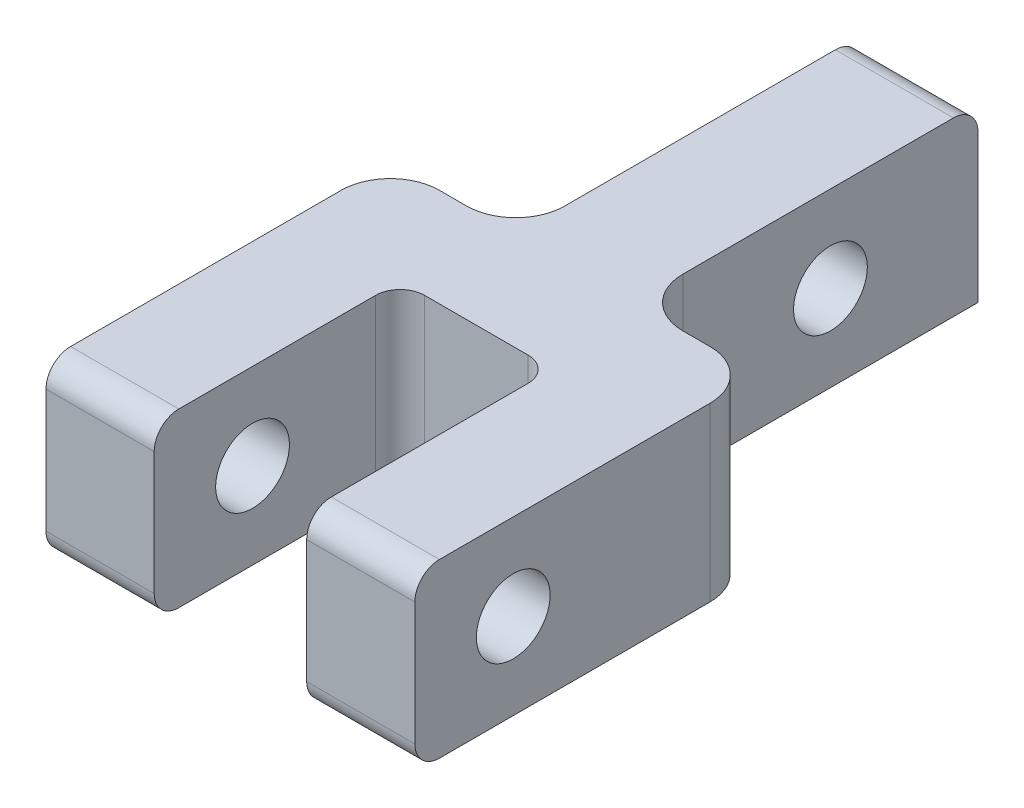
ISO-10303-21;
HEADER;
FILE_DESCRIPTION(('STEP AP214'),'2;1');
FILE_NAME('part.step','',(''),(''),'','','');
FILE_SCHEMA(('AUTOMOTIVE_DESIGN { 1 0 10303 214 1 1 1 1 }'));
ENDSEC;
DATA;
#1=APPLICATION_CONTEXT('core data for automotive mechanical design processes');
#2=APPLICATION_PROTOCOL_DEFINITION('international standard','automotive_design',2000,#1);
#3=PRODUCT_CONTEXT('',#1,'mechanical');
#4=PRODUCT('Part','Part','',(#3));
#5=PRODUCT_RELATED_PRODUCT_CATEGORY('part','',(#4));
#6=PRODUCT_DEFINITION_FORMATION('','',#4);
#7=PRODUCT_DEFINITION_CONTEXT('part definition',#1,'design');
#8=PRODUCT_DEFINITION('design','',#6,#7);
#9=PRODUCT_DEFINITION_SHAPE('','',#8);
#10=(LENGTH_UNIT() NAMED_UNIT(*) SI_UNIT(.MILLI.,.METRE.));
#11=(NAMED_UNIT(*) PLANE_ANGLE_UNIT() SI_UNIT($,.RADIAN.));
#12=(NAMED_UNIT(*) SI_UNIT($,.STERADIAN.) SOLID_ANGLE_UNIT());
#13=UNCERTAINTY_MEASURE_WITH_UNIT(LENGTH_MEASURE(1.E-05),#10,'distance_accuracy_value','');
#14=(GEOMETRIC_REPRESENTATION_CONTEXT(3) GLOBAL_UNCERTAINTY_ASSIGNED_CONTEXT((#13)) GLOBAL_UNIT_ASSIGNED_CONTEXT((#10,
#11,#12)) REPRESENTATION_CONTEXT('',''));
#15=CARTESIAN_POINT('',(0.,0.,0.));
#16=DIRECTION('',(0.,0.,1.));
#17=DIRECTION('',(1.,0.,0.));
#18=AXIS2_PLACEMENT_3D('',#15,#16,#17);
#19=CARTESIAN_POINT('',(2.4,-2.5,13.));
#20=DIRECTION('',(-1.,0.,0.));
#21=DIRECTION('',(0.,0.,1.));
#22=AXIS2_PLACEMENT_3D('',#19,#20,#21);
#23=CYLINDRICAL_SURFACE('',#22,1.);
#24=CARTESIAN_POINT('',(-3.1,-2.5,13.));
#25=DIRECTION('',(1.,0.,0.));
#26=DIRECTION('',(0.,0.,-1.));
#27=AXIS2_PLACEMENT_3D('',#24,#25,#26);
#28=CIRCLE('',#27,0.999999999999999);
#29=CARTESIAN_POINT('',(-3.1,-2.5,14.));
#30=VERTEX_POINT('',#29);
#31=CARTESIAN_POINT('',(-3.1,-3.5,13.));
#32=VERTEX_POINT('',#31);
#33=EDGE_CURVE('E208',#30,#32,#28,.T.);
#34=ORIENTED_EDGE('',*,*,#33,.F.);
#35=DIRECTION('',(-1.,0.,0.));
#36=VECTOR('',#35,1.);
#37=CARTESIAN_POINT('',(2.4,-2.5,14.));
#38=LINE('',#37,#36);
#39=CARTESIAN_POINT('',(-7.5,-2.5,14.));
#40=VERTEX_POINT('',#39);
#41=EDGE_CURVE('E207',#30,#40,#38,.T.);
#42=ORIENTED_EDGE('',*,*,#41,.T.);
#43=CARTESIAN_POINT('',(-7.5,-2.5,13.));
#44=DIRECTION('',(1.,0.,0.));
#45=DIRECTION('',(0.,0.,-1.));
#46=AXIS2_PLACEMENT_3D('',#43,#44,#45);
#47=CIRCLE('',#46,1.);
#48=CARTESIAN_POINT('',(-7.5,-3.5,13.));
#49=VERTEX_POINT('',#48);
#50=EDGE_CURVE('E350',#40,#49,#47,.T.);
#51=ORIENTED_EDGE('',*,*,#50,.T.);
#52=DIRECTION('',(-1.,0.,0.));
#53=VECTOR('',#52,1.);
#54=CARTESIAN_POINT('',(2.4,-3.5,13.));
#55=LINE('',#54,#53);
#56=EDGE_CURVE('E235',#32,#49,#55,.T.);
#57=ORIENTED_EDGE('',*,*,#56,.F.);
#58=EDGE_LOOP('',(#34,#42,#51,#57));
#59=FACE_BOUND('',#58,.T.);
#60=ADVANCED_FACE('F33',(#59),#23,.T.);
#61=CARTESIAN_POINT('',(2.4,-3.49999999999999,-14.));
#62=DIRECTION('',(0.,1.,0.));
#63=DIRECTION('',(0.,0.,1.));
#64=AXIS2_PLACEMENT_3D('',#61,#62,#63);
#65=PLANE('',#64);
#66=DIRECTION('',(-1.,0.,0.));
#67=VECTOR('',#66,1.);
#68=CARTESIAN_POINT('',(7.5,-3.5,0.));
#69=LINE('',#68,#67);
#70=CARTESIAN_POINT('',(5.5,-3.5,0.));
#71=VERTEX_POINT('',#70);
#72=CARTESIAN_POINT('',(4.4,-3.5,0.));
#73=VERTEX_POINT('',#72);
#74=EDGE_CURVE('E363',#71,#73,#69,.T.);
#75=ORIENTED_EDGE('',*,*,#74,.F.);
#76=CARTESIAN_POINT('',(5.5,-3.50000000000008,2.));
#77=DIRECTION('',(0.,1.,0.));
#78=DIRECTION('',(0.,0.,1.));
#79=AXIS2_PLACEMENT_3D('',#76,#77,#78);
#80=CIRCLE('',#79,2.);
#81=CARTESIAN_POINT('',(7.5,-3.5,2.));
#82=VERTEX_POINT('',#81);
#83=EDGE_CURVE('E260',#71,#82,#80,.F.);
#84=ORIENTED_EDGE('',*,*,#83,.T.);
#85=DIRECTION('',(0.,0.,-1.));
#86=VECTOR('',#85,1.);
#87=CARTESIAN_POINT('',(7.5,-3.5,0.));
#88=LINE('',#87,#86);
#89=CARTESIAN_POINT('',(7.5,-3.5,13.));
#90=VERTEX_POINT('',#89);
#91=EDGE_CURVE('E341',#90,#82,#88,.T.);
#92=ORIENTED_EDGE('',*,*,#91,.F.);
#93=CARTESIAN_POINT('',(3.1,-3.5,13.));
#94=VERTEX_POINT('',#93);
#95=EDGE_CURVE('E236',#90,#94,#55,.T.);
#96=ORIENTED_EDGE('',*,*,#95,.T.);
#97=DIRECTION('',(0.,0.,-1.));
#98=VECTOR('',#97,1.);
#99=CARTESIAN_POINT('',(3.1,-3.5,4.));
#100=LINE('',#99,#98);
#101=CARTESIAN_POINT('',(3.1,-3.5,5.));
#102=VERTEX_POINT('',#101);
#103=EDGE_CURVE('E321',#94,#102,#100,.T.);
#104=ORIENTED_EDGE('',*,*,#103,.T.);
#105=CARTESIAN_POINT('',(2.1,-3.50000000000009,5.));
#106=DIRECTION('',(0.,1.,0.));
#107=DIRECTION('',(0.,0.,1.));
#108=AXIS2_PLACEMENT_3D('',#105,#106,#107);
#109=CIRCLE('',#108,1.);
#110=CARTESIAN_POINT('',(2.1,-3.5,4.));
#111=VERTEX_POINT('',#110);
#112=EDGE_CURVE('E294',#102,#111,#109,.T.);
#113=ORIENTED_EDGE('',*,*,#112,.T.);
#114=DIRECTION('',(1.,0.,0.));
#115=VECTOR('',#114,1.);
#116=CARTESIAN_POINT('',(-3.1,-3.5,4.));
#117=LINE('',#116,#115);
#118=CARTESIAN_POINT('',(-2.1,-3.5,4.));
#119=VERTEX_POINT('',#118);
#120=EDGE_CURVE('E304',#119,#111,#117,.T.);
#121=ORIENTED_EDGE('',*,*,#120,.F.);
#122=CARTESIAN_POINT('',(-2.1,-3.50000000000009,5.));
#123=DIRECTION('',(0.,1.,0.));
#124=DIRECTION('',(0.,0.,1.));
#125=AXIS2_PLACEMENT_3D('',#122,#123,#124);
#126=CIRCLE('',#125,1.);
#127=CARTESIAN_POINT('',(-3.1,-3.5,5.));
#128=VERTEX_POINT('',#127);
#129=EDGE_CURVE('E11',#119,#128,#126,.T.);
#130=ORIENTED_EDGE('',*,*,#129,.T.);
#131=DIRECTION('',(0.,0.,-1.));
#132=VECTOR('',#131,1.);
#133=CARTESIAN_POINT('',(-3.1,-3.5,4.));
#134=LINE('',#133,#132);
#135=EDGE_CURVE('E306',#32,#128,#134,.T.);
#136=ORIENTED_EDGE('',*,*,#135,.F.);
#137=ORIENTED_EDGE('',*,*,#56,.T.);
#138=DIRECTION('',(0.,0.,-1.));
#139=VECTOR('',#138,1.);
#140=CARTESIAN_POINT('',(-7.5,-3.5,0.));
#141=LINE('',#140,#139);
#142=CARTESIAN_POINT('',(-7.5,-3.5,2.));
#143=VERTEX_POINT('',#142);
#144=EDGE_CURVE('E353',#49,#143,#141,.T.);
#145=ORIENTED_EDGE('',*,*,#144,.T.);
#146=CARTESIAN_POINT('',(-5.5,-3.50000000000008,2.));
#147=DIRECTION('',(0.,1.,0.));
#148=DIRECTION('',(0.,0.,1.));
#149=AXIS2_PLACEMENT_3D('',#146,#147,#148);
#150=CIRCLE('',#149,2.);
#151=CARTESIAN_POINT('',(-5.5,-3.5,0.));
#152=VERTEX_POINT('',#151);
#153=EDGE_CURVE('E258',#143,#152,#150,.F.);
#154=ORIENTED_EDGE('',*,*,#153,.T.);
#155=CARTESIAN_POINT('',(-4.4,-3.5,0.));
#156=VERTEX_POINT('',#155);
#157=EDGE_CURVE('E360',#156,#152,#69,.T.);
#158=ORIENTED_EDGE('',*,*,#157,.F.);
#159=CARTESIAN_POINT('',(-4.4,-3.50000000000006,-2.));
#160=DIRECTION('',(0.,1.,0.));
#161=DIRECTION('',(0.,0.,1.));
#162=AXIS2_PLACEMENT_3D('',#159,#160,#161);
#163=CIRCLE('',#162,2.);
#164=CARTESIAN_POINT('',(-2.4,-3.50000000000006,-2.));
#165=VERTEX_POINT('',#164);
#166=EDGE_CURVE('E279',#156,#165,#163,.T.);
#167=ORIENTED_EDGE('',*,*,#166,.T.);
#168=DIRECTION('',(0.,0.,-1.));
#169=VECTOR('',#168,1.);
#170=CARTESIAN_POINT('',(-2.4,-3.49999999999999,-14.));
#171=LINE('',#170,#169);
#172=CARTESIAN_POINT('',(-2.4,-3.49999999999999,-14.));
#173=VERTEX_POINT('',#172);
#174=EDGE_CURVE('E370',#165,#173,#171,.T.);
#175=ORIENTED_EDGE('',*,*,#174,.T.);
#176=DIRECTION('',(-1.,0.,0.));
#177=VECTOR('',#176,1.);
#178=CARTESIAN_POINT('',(2.4,-3.49999999999999,-14.));
#179=LINE('',#178,#177);
#180=CARTESIAN_POINT('',(2.4,-3.49999999999999,-14.));
#181=VERTEX_POINT('',#180);
#182=EDGE_CURVE('E232',#181,#173,#179,.T.);
#183=ORIENTED_EDGE('',*,*,#182,.F.);
#184=DIRECTION('',(0.,0.,-1.));
#185=VECTOR('',#184,1.);
#186=CARTESIAN_POINT('',(2.4,-3.5,13.));
#187=LINE('',#186,#185);
#188=CARTESIAN_POINT('',(2.4,-3.5,-2.));
#189=VERTEX_POINT('',#188);
#190=EDGE_CURVE('E371',#189,#181,#187,.T.);
#191=ORIENTED_EDGE('',*,*,#190,.F.);
#192=CARTESIAN_POINT('',(4.4,-3.50000000000006,-2.));
#193=DIRECTION('',(0.,1.,0.));
#194=DIRECTION('',(0.,0.,1.));
#195=AXIS2_PLACEMENT_3D('',#192,#193,#194);
#196=CIRCLE('',#195,2.);
#197=EDGE_CURVE('E275',#189,#73,#196,.T.);
#198=ORIENTED_EDGE('',*,*,#197,.T.);
#199=EDGE_LOOP('',(#75,#84,#92,#96,#104,#113,#121,#130,#136,#137,#145,#154,#158,#167,#175,#183,
#191,#198));
#200=FACE_BOUND('',#199,.T.);
#201=ADVANCED_FACE('F402',(#200),#65,.F.);
#202=CARTESIAN_POINT('',(2.4,3.5,13.));
#203=DIRECTION('',(0.,-1.,0.));
#204=DIRECTION('',(0.,0.,-1.));
#205=AXIS2_PLACEMENT_3D('',#202,#203,#204);
#206=PLANE('',#205);
#207=DIRECTION('',(0.,0.,1.));
#208=VECTOR('',#207,1.);
#209=CARTESIAN_POINT('',(7.5,3.5,13.));
#210=LINE('',#209,#208);
#211=CARTESIAN_POINT('',(7.5,3.5,2.));
#212=VERTEX_POINT('',#211);
#213=CARTESIAN_POINT('',(7.5,3.5,13.));
#214=VERTEX_POINT('',#213);
#215=EDGE_CURVE('E344',#212,#214,#210,.T.);
#216=ORIENTED_EDGE('',*,*,#215,.F.);
#217=CARTESIAN_POINT('',(5.5,3.5,2.));
#218=DIRECTION('',(0.,-1.,0.));
#219=DIRECTION('',(0.,0.,-1.));
#220=AXIS2_PLACEMENT_3D('',#217,#218,#219);
#221=CIRCLE('',#220,2.);
#222=CARTESIAN_POINT('',(5.5,3.5,0.));
#223=VERTEX_POINT('',#222);
#224=EDGE_CURVE('E252',#212,#223,#221,.F.);
#225=ORIENTED_EDGE('',*,*,#224,.T.);
#226=DIRECTION('',(-1.,0.,0.));
#227=VECTOR('',#226,1.);
#228=CARTESIAN_POINT('',(7.5,3.5,0.));
#229=LINE('',#228,#227);
#230=CARTESIAN_POINT('',(4.4,3.5,0.));
#231=VERTEX_POINT('',#230);
#232=EDGE_CURVE('E359',#223,#231,#229,.T.);
#233=ORIENTED_EDGE('',*,*,#232,.T.);
#234=CARTESIAN_POINT('',(4.4,3.5,-2.));
#235=DIRECTION('',(0.,-1.,0.));
#236=DIRECTION('',(0.,0.,-1.));
#237=AXIS2_PLACEMENT_3D('',#234,#235,#236);
#238=CIRCLE('',#237,2.);
#239=CARTESIAN_POINT('',(2.4,3.5,-2.));
#240=VERTEX_POINT('',#239);
#241=EDGE_CURVE('E277',#231,#240,#238,.T.);
#242=ORIENTED_EDGE('',*,*,#241,.T.);
#243=DIRECTION('',(0.,0.,1.));
#244=VECTOR('',#243,1.);
#245=CARTESIAN_POINT('',(2.4,3.5,13.));
#246=LINE('',#245,#244);
#247=CARTESIAN_POINT('',(2.4,3.5,-13.));
#248=VERTEX_POINT('',#247);
#249=EDGE_CURVE('E378',#248,#240,#246,.T.);
#250=ORIENTED_EDGE('',*,*,#249,.F.);
#251=DIRECTION('',(-1.,0.,0.));
#252=VECTOR('',#251,1.);
#253=CARTESIAN_POINT('',(2.4,3.5,-13.));
#254=LINE('',#253,#252);
#255=CARTESIAN_POINT('',(-2.4,3.5,-13.));
#256=VERTEX_POINT('',#255);
#257=EDGE_CURVE('E226',#248,#256,#254,.T.);
#258=ORIENTED_EDGE('',*,*,#257,.T.);
#259=DIRECTION('',(0.,0.,1.));
#260=VECTOR('',#259,1.);
#261=CARTESIAN_POINT('',(-2.4,3.5,13.));
#262=LINE('',#261,#260);
#263=CARTESIAN_POINT('',(-2.4,3.5,-2.));
#264=VERTEX_POINT('',#263);
#265=EDGE_CURVE('E374',#256,#264,#262,.T.);
#266=ORIENTED_EDGE('',*,*,#265,.T.);
#267=CARTESIAN_POINT('',(-4.4,3.5,-2.));
#268=DIRECTION('',(0.,-1.,0.));
#269=DIRECTION('',(0.,0.,-1.));
#270=AXIS2_PLACEMENT_3D('',#267,#268,#269);
#271=CIRCLE('',#270,2.);
#272=CARTESIAN_POINT('',(-4.4,3.5,0.));
#273=VERTEX_POINT('',#272);
#274=EDGE_CURVE('E281',#264,#273,#271,.T.);
#275=ORIENTED_EDGE('',*,*,#274,.T.);
#276=CARTESIAN_POINT('',(-5.5,3.5,0.));
#277=VERTEX_POINT('',#276);
#278=EDGE_CURVE('E346',#273,#277,#229,.T.);
#279=ORIENTED_EDGE('',*,*,#278,.T.);
#280=CARTESIAN_POINT('',(-5.5,3.5,2.));
#281=DIRECTION('',(0.,-1.,0.));
#282=DIRECTION('',(0.,0.,-1.));
#283=AXIS2_PLACEMENT_3D('',#280,#281,#282);
#284=CIRCLE('',#283,2.);
#285=CARTESIAN_POINT('',(-7.5,3.5,2.));
#286=VERTEX_POINT('',#285);
#287=EDGE_CURVE('E250',#277,#286,#284,.F.);
#288=ORIENTED_EDGE('',*,*,#287,.T.);
#289=DIRECTION('',(0.,0.,1.));
#290=VECTOR('',#289,1.);
#291=CARTESIAN_POINT('',(-7.5,3.5,13.));
#292=LINE('',#291,#290);
#293=CARTESIAN_POINT('',(-7.5,3.5,13.));
#294=VERTEX_POINT('',#293);
#295=EDGE_CURVE('E335',#286,#294,#292,.T.);
#296=ORIENTED_EDGE('',*,*,#295,.T.);
#297=DIRECTION('',(-1.,0.,0.));
#298=VECTOR('',#297,1.);
#299=CARTESIAN_POINT('',(2.4,3.5,13.));
#300=LINE('',#299,#298);
#301=CARTESIAN_POINT('',(-3.1,3.5,13.));
#302=VERTEX_POINT('',#301);
#303=EDGE_CURVE('E218',#302,#294,#300,.T.);
#304=ORIENTED_EDGE('',*,*,#303,.F.);
#305=DIRECTION('',(0.,0.,1.));
#306=VECTOR('',#305,1.);
#307=CARTESIAN_POINT('',(-3.1,3.5,13.));
#308=LINE('',#307,#306);
#309=CARTESIAN_POINT('',(-3.1,3.5,5.));
#310=VERTEX_POINT('',#309);
#311=EDGE_CURVE('E194',#310,#302,#308,.T.);
#312=ORIENTED_EDGE('',*,*,#311,.F.);
#313=CARTESIAN_POINT('',(-2.1,3.5,5.));
#314=DIRECTION('',(0.,-1.,0.));
#315=DIRECTION('',(0.,0.,-1.));
#316=AXIS2_PLACEMENT_3D('',#313,#314,#315);
#317=CIRCLE('',#316,1.);
#318=CARTESIAN_POINT('',(-2.1,3.5,4.));
#319=VERTEX_POINT('',#318);
#320=EDGE_CURVE('E41',#310,#319,#317,.T.);
#321=ORIENTED_EDGE('',*,*,#320,.T.);
#322=DIRECTION('',(1.,0.,0.));
#323=VECTOR('',#322,1.);
#324=CARTESIAN_POINT('',(-3.1,3.5,4.));
#325=LINE('',#324,#323);
#326=CARTESIAN_POINT('',(2.1,3.5,4.));
#327=VERTEX_POINT('',#326);
#328=EDGE_CURVE('E244',#319,#327,#325,.T.);
#329=ORIENTED_EDGE('',*,*,#328,.T.);
#330=CARTESIAN_POINT('',(2.1,3.5,5.));
#331=DIRECTION('',(0.,-1.,0.));
#332=DIRECTION('',(0.,0.,-1.));
#333=AXIS2_PLACEMENT_3D('',#330,#331,#332);
#334=CIRCLE('',#333,1.);
#335=CARTESIAN_POINT('',(3.1,3.5,5.));
#336=VERTEX_POINT('',#335);
#337=EDGE_CURVE('E292',#327,#336,#334,.T.);
#338=ORIENTED_EDGE('',*,*,#337,.T.);
#339=DIRECTION('',(0.,0.,1.));
#340=VECTOR('',#339,1.);
#341=CARTESIAN_POINT('',(3.1,3.5,13.));
#342=LINE('',#341,#340);
#343=CARTESIAN_POINT('',(3.1,3.5,13.));
#344=VERTEX_POINT('',#343);
#345=EDGE_CURVE('E199',#336,#344,#342,.T.);
#346=ORIENTED_EDGE('',*,*,#345,.T.);
#347=EDGE_CURVE('E223',#214,#344,#300,.T.);
#348=ORIENTED_EDGE('',*,*,#347,.F.);
#349=EDGE_LOOP('',(#216,#225,#233,#242,#250,#258,#266,#275,#279,#288,#296,#304,#312,#321,#329,
#338,#346,#348));
#350=FACE_BOUND('',#349,.T.);
#351=ADVANCED_FACE('F299',(#350),#206,.F.);
#352=CARTESIAN_POINT('',(2.4,2.5,13.));
#353=DIRECTION('',(-1.,0.,0.));
#354=DIRECTION('',(0.,0.,1.));
#355=AXIS2_PLACEMENT_3D('',#352,#353,#354);
#356=CYLINDRICAL_SURFACE('',#355,1.);
#357=CARTESIAN_POINT('',(-3.1,2.5,13.));
#358=DIRECTION('',(1.,0.,0.));
#359=DIRECTION('',(0.,0.,-1.));
#360=AXIS2_PLACEMENT_3D('',#357,#358,#359);
#361=CIRCLE('',#360,0.999999999999999);
#362=CARTESIAN_POINT('',(-3.1,2.5,14.));
#363=VERTEX_POINT('',#362);
#364=EDGE_CURVE('E187',#302,#363,#361,.T.);
#365=ORIENTED_EDGE('',*,*,#364,.F.);
#366=ORIENTED_EDGE('',*,*,#303,.T.);
#367=CARTESIAN_POINT('',(-7.5,2.5,13.));
#368=DIRECTION('',(1.,0.,0.));
#369=DIRECTION('',(0.,0.,-1.));
#370=AXIS2_PLACEMENT_3D('',#367,#368,#369);
#371=CIRCLE('',#370,0.999999999999999);
#372=CARTESIAN_POINT('',(-7.5,2.5,14.));
#373=VERTEX_POINT('',#372);
#374=EDGE_CURVE('E213',#294,#373,#371,.T.);
#375=ORIENTED_EDGE('',*,*,#374,.T.);
#376=DIRECTION('',(-1.,0.,0.));
#377=VECTOR('',#376,1.);
#378=CARTESIAN_POINT('',(2.4,2.5,14.));
#379=LINE('',#378,#377);
#380=EDGE_CURVE('E205',#363,#373,#379,.T.);
#381=ORIENTED_EDGE('',*,*,#380,.F.);
#382=EDGE_LOOP('',(#365,#366,#375,#381));
#383=FACE_BOUND('',#382,.T.);
#384=ADVANCED_FACE('F211',(#383),#356,.T.);
#385=CARTESIAN_POINT('',(2.4,2.5,14.));
#386=DIRECTION('',(0.,0.,-1.));
#387=DIRECTION('',(-1.,0.,0.));
#388=AXIS2_PLACEMENT_3D('',#385,#386,#387);
#389=PLANE('',#388);
#390=DIRECTION('',(0.,-1.,0.));
#391=VECTOR('',#390,1.);
#392=CARTESIAN_POINT('',(-3.1,2.5,14.));
#393=LINE('',#392,#391);
#394=EDGE_CURVE('E191',#363,#30,#393,.T.);
#395=ORIENTED_EDGE('',*,*,#394,.F.);
#396=ORIENTED_EDGE('',*,*,#380,.T.);
#397=DIRECTION('',(0.,-1.,0.));
#398=VECTOR('',#397,1.);
#399=CARTESIAN_POINT('',(-7.5,2.5,14.));
#400=LINE('',#399,#398);
#401=EDGE_CURVE('E348',#373,#40,#400,.T.);
#402=ORIENTED_EDGE('',*,*,#401,.T.);
#403=ORIENTED_EDGE('',*,*,#41,.F.);
#404=EDGE_LOOP('',(#395,#396,#402,#403));
#405=FACE_BOUND('',#404,.T.);
#406=ADVANCED_FACE('F203',(#405),#389,.F.);
#407=CARTESIAN_POINT('',(-2.4,0.,10.));
#408=DIRECTION('',(1.,0.,0.));
#409=DIRECTION('',(0.,0.,-1.));
#410=AXIS2_PLACEMENT_3D('',#407,#408,#409);
#411=CYLINDRICAL_SURFACE('',#410,1.5);
#412=CARTESIAN_POINT('',(-7.5,0.,10.));
#413=DIRECTION('',(1.,0.,0.));
#414=DIRECTION('',(0.,0.,-1.));
#415=AXIS2_PLACEMENT_3D('',#412,#413,#414);
#416=CIRCLE('',#415,1.5);
#417=CARTESIAN_POINT('',(-7.5,0.,8.49999999999999));
#418=VERTEX_POINT('',#417);
#419=EDGE_CURVE('E247',#418,#418,#416,.T.);
#420=ORIENTED_EDGE('',*,*,#419,.F.);
#421=EDGE_LOOP('',(#420));
#422=FACE_BOUND('',#421,.T.);
#423=CARTESIAN_POINT('',(-3.1,0.,10.));
#424=DIRECTION('',(1.,0.,0.));
#425=DIRECTION('',(0.,0.,-1.));
#426=AXIS2_PLACEMENT_3D('',#423,#424,#425);
#427=CIRCLE('',#426,1.5);
#428=CARTESIAN_POINT('',(-3.1,0.,8.49999999999999));
#429=VERTEX_POINT('',#428);
#430=EDGE_CURVE('E243',#429,#429,#427,.F.);
#431=ORIENTED_EDGE('',*,*,#430,.F.);
#432=EDGE_LOOP('',(#431));
#433=FACE_BOUND('',#432,.T.);
#434=ADVANCED_FACE('F495',(#422,#433),#411,.F.);
#435=CARTESIAN_POINT('',(2.4,-2.5,13.));
#436=DIRECTION('',(1.,0.,0.));
#437=DIRECTION('',(0.,0.,-1.));
#438=AXIS2_PLACEMENT_3D('',#435,#436,#437);
#439=PLANE('',#438);
#440=CARTESIAN_POINT('',(2.4,0.,-8.));
#441=DIRECTION('',(1.,0.,0.));
#442=DIRECTION('',(0.,0.,-1.));
#443=AXIS2_PLACEMENT_3D('',#440,#441,#442);
#444=CIRCLE('',#443,1.5);
#445=CARTESIAN_POINT('',(2.4,0.,-9.50000000000001));
#446=VERTEX_POINT('',#445);
#447=EDGE_CURVE('E364',#446,#446,#444,.T.);
#448=ORIENTED_EDGE('',*,*,#447,.F.);
#449=EDGE_LOOP('',(#448));
#450=FACE_BOUND('',#449,.T.);
#451=ORIENTED_EDGE('',*,*,#249,.T.);
#452=DIRECTION('',(0.,-1.,0.));
#453=VECTOR('',#452,1.);
#454=CARTESIAN_POINT('',(2.4,-2.5,-2.));
#455=LINE('',#454,#453);
#456=EDGE_CURVE('E270',#240,#189,#455,.T.);
#457=ORIENTED_EDGE('',*,*,#456,.T.);
#458=ORIENTED_EDGE('',*,*,#190,.T.);
#459=DIRECTION('',(0.,1.,0.));
#460=VECTOR('',#459,1.);
#461=CARTESIAN_POINT('',(2.4,-2.5,-14.));
#462=LINE('',#461,#460);
#463=CARTESIAN_POINT('',(2.4,2.5,-14.));
#464=VERTEX_POINT('',#463);
#465=EDGE_CURVE('E373',#181,#464,#462,.T.);
#466=ORIENTED_EDGE('',*,*,#465,.T.);
#467=CARTESIAN_POINT('',(2.4,2.5,-13.));
#468=DIRECTION('',(1.,0.,0.));
#469=DIRECTION('',(0.,0.,1.));
#470=AXIS2_PLACEMENT_3D('',#467,#468,#469);
#471=CIRCLE('',#470,1.);
#472=EDGE_CURVE('E376',#464,#248,#471,.T.);
#473=ORIENTED_EDGE('',*,*,#472,.T.);
#474=EDGE_LOOP('',(#451,#457,#458,#466,#473));
#475=FACE_BOUND('',#474,.T.);
#476=ADVANCED_FACE('F434',(#450,#475),#439,.T.);
#477=CARTESIAN_POINT('',(-2.4,-2.5,13.));
#478=DIRECTION('',(1.,0.,0.));
#479=DIRECTION('',(0.,0.,-1.));
#480=AXIS2_PLACEMENT_3D('',#477,#478,#479);
#481=PLANE('',#480);
#482=CARTESIAN_POINT('',(-2.4,0.,-8.));
#483=DIRECTION('',(1.,0.,0.));
#484=DIRECTION('',(0.,0.,-1.));
#485=AXIS2_PLACEMENT_3D('',#482,#483,#484);
#486=CIRCLE('',#485,1.5);
#487=CARTESIAN_POINT('',(-2.4,0.,-9.50000000000001));
#488=VERTEX_POINT('',#487);
#489=EDGE_CURVE('E367',#488,#488,#486,.T.);
#490=ORIENTED_EDGE('',*,*,#489,.T.);
#491=EDGE_LOOP('',(#490));
#492=FACE_BOUND('',#491,.T.);
#493=ORIENTED_EDGE('',*,*,#174,.F.);
#494=DIRECTION('',(0.,-1.,0.));
#495=VECTOR('',#494,1.);
#496=CARTESIAN_POINT('',(-2.4,3.5,-2.));
#497=LINE('',#496,#495);
#498=EDGE_CURVE('E273',#165,#264,#497,.F.);
#499=ORIENTED_EDGE('',*,*,#498,.T.);
#500=ORIENTED_EDGE('',*,*,#265,.F.);
#501=CARTESIAN_POINT('',(-2.4,2.5,-13.));
#502=DIRECTION('',(1.,0.,0.));
#503=DIRECTION('',(0.,0.,1.));
#504=AXIS2_PLACEMENT_3D('',#501,#502,#503);
#505=CIRCLE('',#504,1.);
#506=CARTESIAN_POINT('',(-2.4,2.5,-14.));
#507=VERTEX_POINT('',#506);
#508=EDGE_CURVE('E384',#507,#256,#505,.T.);
#509=ORIENTED_EDGE('',*,*,#508,.F.);
#510=DIRECTION('',(0.,1.,0.));
#511=VECTOR('',#510,1.);
#512=CARTESIAN_POINT('',(-2.4,2.5,-14.));
#513=LINE('',#512,#511);
#514=EDGE_CURVE('E382',#173,#507,#513,.T.);
#515=ORIENTED_EDGE('',*,*,#514,.F.);
#516=EDGE_LOOP('',(#493,#499,#500,#509,#515));
#517=FACE_BOUND('',#516,.T.);
#518=ADVANCED_FACE('F425',(#492,#517),#481,.F.);
#519=CARTESIAN_POINT('',(7.5,-2.5,14.));
#520=VERTEX_POINT('',#519);
#521=CARTESIAN_POINT('',(3.1,-2.5,14.));
#522=VERTEX_POINT('',#521);
#523=EDGE_CURVE('E215',#520,#522,#38,.T.);
#524=ORIENTED_EDGE('',*,*,#523,.T.);
#525=CARTESIAN_POINT('',(3.1,-2.5,13.));
#526=DIRECTION('',(1.,0.,0.));
#527=DIRECTION('',(0.,0.,-1.));
#528=AXIS2_PLACEMENT_3D('',#525,#526,#527);
#529=CIRCLE('',#528,0.999999999999999);
#530=EDGE_CURVE('E318',#522,#94,#529,.T.);
#531=ORIENTED_EDGE('',*,*,#530,.T.);
#532=ORIENTED_EDGE('',*,*,#95,.F.);
#533=CARTESIAN_POINT('',(7.5,-2.5,13.));
#534=DIRECTION('',(1.,0.,0.));
#535=DIRECTION('',(0.,0.,-1.));
#536=AXIS2_PLACEMENT_3D('',#533,#534,#535);
#537=CIRCLE('',#536,1.);
#538=EDGE_CURVE('E338',#520,#90,#537,.T.);
#539=ORIENTED_EDGE('',*,*,#538,.F.);
#540=EDGE_LOOP('',(#524,#531,#532,#539));
#541=FACE_BOUND('',#540,.T.);
#542=ADVANCED_FACE('F417',(#541),#23,.T.);
#543=CARTESIAN_POINT('',(2.4,2.5,-14.));
#544=DIRECTION('',(0.,0.,1.));
#545=DIRECTION('',(1.,0.,0.));
#546=AXIS2_PLACEMENT_3D('',#543,#544,#545);
#547=PLANE('',#546);
#548=ORIENTED_EDGE('',*,*,#514,.T.);
#549=DIRECTION('',(-1.,0.,0.));
#550=VECTOR('',#549,1.);
#551=CARTESIAN_POINT('',(2.4,2.5,-14.));
#552=LINE('',#551,#550);
#553=EDGE_CURVE('E229',#464,#507,#552,.T.);
#554=ORIENTED_EDGE('',*,*,#553,.F.);
#555=ORIENTED_EDGE('',*,*,#465,.F.);
#556=ORIENTED_EDGE('',*,*,#182,.T.);
#557=EDGE_LOOP('',(#548,#554,#555,#556));
#558=FACE_BOUND('',#557,.T.);
#559=ADVANCED_FACE('F424',(#558),#547,.F.);
#560=CARTESIAN_POINT('',(2.4,2.5,-13.));
#561=DIRECTION('',(-1.,0.,0.));
#562=DIRECTION('',(0.,0.,1.));
#563=AXIS2_PLACEMENT_3D('',#560,#561,#562);
#564=CYLINDRICAL_SURFACE('',#563,1.);
#565=ORIENTED_EDGE('',*,*,#508,.T.);
#566=ORIENTED_EDGE('',*,*,#257,.F.);
#567=ORIENTED_EDGE('',*,*,#472,.F.);
#568=ORIENTED_EDGE('',*,*,#553,.T.);
#569=EDGE_LOOP('',(#565,#566,#567,#568));
#570=FACE_BOUND('',#569,.T.);
#571=ADVANCED_FACE('F431',(#570),#564,.T.);
#572=ORIENTED_EDGE('',*,*,#347,.T.);
#573=CARTESIAN_POINT('',(3.1,2.5,13.));
#574=DIRECTION('',(1.,0.,0.));
#575=DIRECTION('',(0.,0.,-1.));
#576=AXIS2_PLACEMENT_3D('',#573,#574,#575);
#577=CIRCLE('',#576,0.999999999999999);
#578=CARTESIAN_POINT('',(3.1,2.5,14.));
#579=VERTEX_POINT('',#578);
#580=EDGE_CURVE('E312',#344,#579,#577,.T.);
#581=ORIENTED_EDGE('',*,*,#580,.T.);
#582=CARTESIAN_POINT('',(7.5,2.5,14.));
#583=VERTEX_POINT('',#582);
#584=EDGE_CURVE('E214',#583,#579,#379,.T.);
#585=ORIENTED_EDGE('',*,*,#584,.F.);
#586=CARTESIAN_POINT('',(7.5,2.5,13.));
#587=DIRECTION('',(1.,0.,0.));
#588=DIRECTION('',(0.,0.,-1.));
#589=AXIS2_PLACEMENT_3D('',#586,#587,#588);
#590=CIRCLE('',#589,0.999999999999999);
#591=EDGE_CURVE('E331',#214,#583,#590,.T.);
#592=ORIENTED_EDGE('',*,*,#591,.F.);
#593=EDGE_LOOP('',(#572,#581,#585,#592));
#594=FACE_BOUND('',#593,.T.);
#595=ADVANCED_FACE('F448',(#594),#356,.T.);
#596=ORIENTED_EDGE('',*,*,#584,.T.);
#597=DIRECTION('',(0.,-1.,0.));
#598=VECTOR('',#597,1.);
#599=CARTESIAN_POINT('',(3.1,2.5,14.));
#600=LINE('',#599,#598);
#601=EDGE_CURVE('E315',#579,#522,#600,.T.);
#602=ORIENTED_EDGE('',*,*,#601,.T.);
#603=ORIENTED_EDGE('',*,*,#523,.F.);
#604=DIRECTION('',(0.,-1.,0.));
#605=VECTOR('',#604,1.);
#606=CARTESIAN_POINT('',(7.5,2.5,14.));
#607=LINE('',#606,#605);
#608=EDGE_CURVE('E334',#583,#520,#607,.T.);
#609=ORIENTED_EDGE('',*,*,#608,.F.);
#610=EDGE_LOOP('',(#596,#602,#603,#609));
#611=FACE_BOUND('',#610,.T.);
#612=ADVANCED_FACE('F440',(#611),#389,.F.);
#613=CARTESIAN_POINT('',(-2.4,0.,-8.));
#614=DIRECTION('',(1.,0.,0.));
#615=DIRECTION('',(0.,0.,-1.));
#616=AXIS2_PLACEMENT_3D('',#613,#614,#615);
#617=CYLINDRICAL_SURFACE('',#616,1.5);
#618=ORIENTED_EDGE('',*,*,#489,.F.);
#619=EDGE_LOOP('',(#618));
#620=FACE_BOUND('',#619,.T.);
#621=ORIENTED_EDGE('',*,*,#447,.T.);
#622=EDGE_LOOP('',(#621));
#623=FACE_BOUND('',#622,.T.);
#624=ADVANCED_FACE('F491',(#620,#623),#617,.F.);
#625=CARTESIAN_POINT('',(7.5,3.5,0.));
#626=DIRECTION('',(0.,0.,1.));
#627=DIRECTION('',(0.,-1.,0.));
#628=AXIS2_PLACEMENT_3D('',#625,#626,#627);
#629=PLANE('',#628);
#630=ORIENTED_EDGE('',*,*,#157,.T.);
#631=DIRECTION('',(0.,1.,0.));
#632=VECTOR('',#631,1.);
#633=CARTESIAN_POINT('',(-5.5,3.5,0.));
#634=LINE('',#633,#632);
#635=EDGE_CURVE('E265',#152,#277,#634,.T.);
#636=ORIENTED_EDGE('',*,*,#635,.T.);
#637=ORIENTED_EDGE('',*,*,#278,.F.);
#638=DIRECTION('',(0.,-1.,0.));
#639=VECTOR('',#638,1.);
#640=CARTESIAN_POINT('',(-4.4,-3.5,0.));
#641=LINE('',#640,#639);
#642=EDGE_CURVE('E262',#273,#156,#641,.T.);
#643=ORIENTED_EDGE('',*,*,#642,.T.);
#644=EDGE_LOOP('',(#630,#636,#637,#643));
#645=FACE_BOUND('',#644,.T.);
#646=ADVANCED_FACE('F399',(#645),#629,.F.);
#647=CARTESIAN_POINT('',(-7.5,2.5,13.));
#648=DIRECTION('',(1.,0.,0.));
#649=DIRECTION('',(0.,0.,-1.));
#650=AXIS2_PLACEMENT_3D('',#647,#648,#649);
#651=PLANE('',#650);
#652=ORIENTED_EDGE('',*,*,#295,.F.);
#653=DIRECTION('',(0.,1.,0.));
#654=VECTOR('',#653,1.);
#655=CARTESIAN_POINT('',(-7.5,2.5,2.));
#656=LINE('',#655,#654);
#657=EDGE_CURVE('E268',#286,#143,#656,.F.);
#658=ORIENTED_EDGE('',*,*,#657,.T.);
#659=ORIENTED_EDGE('',*,*,#144,.F.);
#660=ORIENTED_EDGE('',*,*,#50,.F.);
#661=ORIENTED_EDGE('',*,*,#401,.F.);
#662=ORIENTED_EDGE('',*,*,#374,.F.);
#663=EDGE_LOOP('',(#652,#658,#659,#660,#661,#662));
#664=FACE_BOUND('',#663,.T.);
#665=ORIENTED_EDGE('',*,*,#419,.T.);
#666=EDGE_LOOP('',(#665));
#667=FACE_BOUND('',#666,.T.);
#668=ADVANCED_FACE('F411',(#664,#667),#651,.F.);
#669=CARTESIAN_POINT('',(3.1,0.,10.));
#670=DIRECTION('',(1.,0.,0.));
#671=DIRECTION('',(0.,0.,-1.));
#672=AXIS2_PLACEMENT_3D('',#669,#670,#671);
#673=CIRCLE('',#672,1.5);
#674=CARTESIAN_POINT('',(3.1,0.,8.49999999999999));
#675=VERTEX_POINT('',#674);
#676=EDGE_CURVE('E240',#675,#675,#673,.F.);
#677=ORIENTED_EDGE('',*,*,#676,.T.);
#678=EDGE_LOOP('',(#677));
#679=FACE_BOUND('',#678,.T.);
#680=CARTESIAN_POINT('',(7.5,0.,10.));
#681=DIRECTION('',(1.,0.,0.));
#682=DIRECTION('',(0.,0.,-1.));
#683=AXIS2_PLACEMENT_3D('',#680,#681,#682);
#684=CIRCLE('',#683,1.5);
#685=CARTESIAN_POINT('',(7.5,0.,8.49999999999999));
#686=VERTEX_POINT('',#685);
#687=EDGE_CURVE('E326',#686,#686,#684,.T.);
#688=ORIENTED_EDGE('',*,*,#687,.T.);
#689=EDGE_LOOP('',(#688));
#690=FACE_BOUND('',#689,.T.);
#691=ADVANCED_FACE('F500',(#679,#690),#411,.F.);
#692=CARTESIAN_POINT('',(7.5,2.5,13.));
#693=DIRECTION('',(1.,0.,0.));
#694=DIRECTION('',(0.,0.,-1.));
#695=AXIS2_PLACEMENT_3D('',#692,#693,#694);
#696=PLANE('',#695);
#697=ORIENTED_EDGE('',*,*,#91,.T.);
#698=DIRECTION('',(0.,1.,0.));
#699=VECTOR('',#698,1.);
#700=CARTESIAN_POINT('',(7.5,3.5,2.));
#701=LINE('',#700,#699);
#702=EDGE_CURVE('E239',#82,#212,#701,.T.);
#703=ORIENTED_EDGE('',*,*,#702,.T.);
#704=ORIENTED_EDGE('',*,*,#215,.T.);
#705=ORIENTED_EDGE('',*,*,#591,.T.);
#706=ORIENTED_EDGE('',*,*,#608,.T.);
#707=ORIENTED_EDGE('',*,*,#538,.T.);
#708=EDGE_LOOP('',(#697,#703,#704,#705,#706,#707));
#709=FACE_BOUND('',#708,.T.);
#710=ORIENTED_EDGE('',*,*,#687,.F.);
#711=EDGE_LOOP('',(#710));
#712=FACE_BOUND('',#711,.T.);
#713=ADVANCED_FACE('F442',(#709,#712),#696,.T.);
#714=ORIENTED_EDGE('',*,*,#232,.F.);
#715=DIRECTION('',(0.,1.,0.));
#716=VECTOR('',#715,1.);
#717=CARTESIAN_POINT('',(5.5,-3.5,0.));
#718=LINE('',#717,#716);
#719=EDGE_CURVE('E256',#223,#71,#718,.F.);
#720=ORIENTED_EDGE('',*,*,#719,.T.);
#721=ORIENTED_EDGE('',*,*,#74,.T.);
#722=DIRECTION('',(0.,-1.,0.));
#723=VECTOR('',#722,1.);
#724=CARTESIAN_POINT('',(4.4,3.5,0.));
#725=LINE('',#724,#723);
#726=EDGE_CURVE('E254',#73,#231,#725,.F.);
#727=ORIENTED_EDGE('',*,*,#726,.T.);
#728=EDGE_LOOP('',(#714,#720,#721,#727));
#729=FACE_BOUND('',#728,.T.);
#730=ADVANCED_FACE('F465',(#729),#629,.F.);
#731=CARTESIAN_POINT('',(-3.1,2.5,13.));
#732=DIRECTION('',(1.,0.,0.));
#733=DIRECTION('',(0.,0.,-1.));
#734=AXIS2_PLACEMENT_3D('',#731,#732,#733);
#735=PLANE('',#734);
#736=ORIENTED_EDGE('',*,*,#135,.T.);
#737=DIRECTION('',(0.,1.,0.));
#738=VECTOR('',#737,1.);
#739=CARTESIAN_POINT('',(-3.1,2.5,5.));
#740=LINE('',#739,#738);
#741=EDGE_CURVE('E290',#128,#310,#740,.T.);
#742=ORIENTED_EDGE('',*,*,#741,.T.);
#743=ORIENTED_EDGE('',*,*,#311,.T.);
#744=ORIENTED_EDGE('',*,*,#364,.T.);
#745=ORIENTED_EDGE('',*,*,#394,.T.);
#746=ORIENTED_EDGE('',*,*,#33,.T.);
#747=EDGE_LOOP('',(#736,#742,#743,#744,#745,#746));
#748=FACE_BOUND('',#747,.T.);
#749=ORIENTED_EDGE('',*,*,#430,.T.);
#750=EDGE_LOOP('',(#749));
#751=FACE_BOUND('',#750,.T.);
#752=ADVANCED_FACE('F189',(#748,#751),#735,.T.);
#753=CARTESIAN_POINT('',(3.1,2.5,13.));
#754=DIRECTION('',(1.,0.,0.));
#755=DIRECTION('',(0.,0.,-1.));
#756=AXIS2_PLACEMENT_3D('',#753,#754,#755);
#757=PLANE('',#756);
#758=ORIENTED_EDGE('',*,*,#345,.F.);
#759=DIRECTION('',(0.,1.,0.));
#760=VECTOR('',#759,1.);
#761=CARTESIAN_POINT('',(3.1,-3.5,5.));
#762=LINE('',#761,#760);
#763=EDGE_CURVE('E288',#336,#102,#762,.F.);
#764=ORIENTED_EDGE('',*,*,#763,.T.);
#765=ORIENTED_EDGE('',*,*,#103,.F.);
#766=ORIENTED_EDGE('',*,*,#530,.F.);
#767=ORIENTED_EDGE('',*,*,#601,.F.);
#768=ORIENTED_EDGE('',*,*,#580,.F.);
#769=EDGE_LOOP('',(#758,#764,#765,#766,#767,#768));
#770=FACE_BOUND('',#769,.T.);
#771=ORIENTED_EDGE('',*,*,#676,.F.);
#772=EDGE_LOOP('',(#771));
#773=FACE_BOUND('',#772,.T.);
#774=ADVANCED_FACE('F452',(#770,#773),#757,.F.);
#775=CARTESIAN_POINT('',(-3.1,3.5,4.));
#776=DIRECTION('',(0.,0.,-1.));
#777=DIRECTION('',(-1.,0.,0.));
#778=AXIS2_PLACEMENT_3D('',#775,#776,#777);
#779=PLANE('',#778);
#780=ORIENTED_EDGE('',*,*,#120,.T.);
#781=DIRECTION('',(0.,1.,0.));
#782=VECTOR('',#781,1.);
#783=CARTESIAN_POINT('',(2.1,3.5,4.));
#784=LINE('',#783,#782);
#785=EDGE_CURVE('E285',#111,#327,#784,.T.);
#786=ORIENTED_EDGE('',*,*,#785,.T.);
#787=ORIENTED_EDGE('',*,*,#328,.F.);
#788=DIRECTION('',(0.,1.,0.));
#789=VECTOR('',#788,1.);
#790=CARTESIAN_POINT('',(-2.1,3.5,4.));
#791=LINE('',#790,#789);
#792=EDGE_CURVE('E283',#319,#119,#791,.F.);
#793=ORIENTED_EDGE('',*,*,#792,.T.);
#794=EDGE_LOOP('',(#780,#786,#787,#793));
#795=FACE_BOUND('',#794,.T.);
#796=ADVANCED_FACE('F302',(#795),#779,.F.);
#797=CARTESIAN_POINT('',(5.5,2.5,2.));
#798=DIRECTION('',(0.,-1.,0.));
#799=DIRECTION('',(0.,0.,-1.));
#800=AXIS2_PLACEMENT_3D('',#797,#798,#799);
#801=CYLINDRICAL_SURFACE('',#800,2.);
#802=ORIENTED_EDGE('',*,*,#83,.F.);
#803=ORIENTED_EDGE('',*,*,#719,.F.);
#804=ORIENTED_EDGE('',*,*,#224,.F.);
#805=ORIENTED_EDGE('',*,*,#702,.F.);
#806=EDGE_LOOP('',(#802,#803,#804,#805));
#807=FACE_BOUND('',#806,.T.);
#808=ADVANCED_FACE('F469',(#807),#801,.T.);
#809=CARTESIAN_POINT('',(-5.5,3.5,2.));
#810=DIRECTION('',(0.,1.,0.));
#811=DIRECTION('',(0.,0.,1.));
#812=AXIS2_PLACEMENT_3D('',#809,#810,#811);
#813=CYLINDRICAL_SURFACE('',#812,2.);
#814=ORIENTED_EDGE('',*,*,#153,.F.);
#815=ORIENTED_EDGE('',*,*,#657,.F.);
#816=ORIENTED_EDGE('',*,*,#287,.F.);
#817=ORIENTED_EDGE('',*,*,#635,.F.);
#818=EDGE_LOOP('',(#814,#815,#816,#817));
#819=FACE_BOUND('',#818,.T.);
#820=ADVANCED_FACE('F408',(#819),#813,.T.);
#821=CARTESIAN_POINT('',(4.4,-2.5,-2.));
#822=DIRECTION('',(0.,-1.,0.));
#823=DIRECTION('',(0.,0.,-1.));
#824=AXIS2_PLACEMENT_3D('',#821,#822,#823);
#825=CYLINDRICAL_SURFACE('',#824,2.);
#826=ORIENTED_EDGE('',*,*,#241,.F.);
#827=ORIENTED_EDGE('',*,*,#726,.F.);
#828=ORIENTED_EDGE('',*,*,#197,.F.);
#829=ORIENTED_EDGE('',*,*,#456,.F.);
#830=EDGE_LOOP('',(#826,#827,#828,#829));
#831=FACE_BOUND('',#830,.T.);
#832=ADVANCED_FACE('F472',(#831),#825,.F.);
#833=CARTESIAN_POINT('',(-4.4,3.5,-2.));
#834=DIRECTION('',(0.,1.,0.));
#835=DIRECTION('',(0.,0.,1.));
#836=AXIS2_PLACEMENT_3D('',#833,#834,#835);
#837=CYLINDRICAL_SURFACE('',#836,2.);
#838=ORIENTED_EDGE('',*,*,#274,.F.);
#839=ORIENTED_EDGE('',*,*,#498,.F.);
#840=ORIENTED_EDGE('',*,*,#166,.F.);
#841=ORIENTED_EDGE('',*,*,#642,.F.);
#842=EDGE_LOOP('',(#838,#839,#840,#841));
#843=FACE_BOUND('',#842,.T.);
#844=ADVANCED_FACE('F396',(#843),#837,.F.);
#845=CARTESIAN_POINT('',(2.1,3.5,5.));
#846=DIRECTION('',(0.,-1.,0.));
#847=DIRECTION('',(0.,0.,-1.));
#848=AXIS2_PLACEMENT_3D('',#845,#846,#847);
#849=CYLINDRICAL_SURFACE('',#848,1.);
#850=ORIENTED_EDGE('',*,*,#112,.F.);
#851=ORIENTED_EDGE('',*,*,#763,.F.);
#852=ORIENTED_EDGE('',*,*,#337,.F.);
#853=ORIENTED_EDGE('',*,*,#785,.F.);
#854=EDGE_LOOP('',(#850,#851,#852,#853));
#855=FACE_BOUND('',#854,.T.);
#856=ADVANCED_FACE('F457',(#855),#849,.F.);
#857=CARTESIAN_POINT('',(-2.1,2.5,5.));
#858=DIRECTION('',(0.,1.,0.));
#859=DIRECTION('',(0.,0.,1.));
#860=AXIS2_PLACEMENT_3D('',#857,#858,#859);
#861=CYLINDRICAL_SURFACE('',#860,1.);
#862=ORIENTED_EDGE('',*,*,#129,.F.);
#863=ORIENTED_EDGE('',*,*,#792,.F.);
#864=ORIENTED_EDGE('',*,*,#320,.F.);
#865=ORIENTED_EDGE('',*,*,#741,.F.);
#866=EDGE_LOOP('',(#862,#863,#864,#865));
#867=FACE_BOUND('',#866,.T.);
#868=ADVANCED_FACE('F35',(#867),#861,.F.);
#869=CLOSED_SHELL('',(#60,#201,#351,#384,#406,#434,#476,#518,#542,#559,#571,#595,#612,#624,#646,
#668,#691,#713,#730,#752,#774,#796,#808,#820,#832,#844,#856,#868));
#870=MANIFOLD_SOLID_BREP('B2',#869);
#871=ADVANCED_BREP_SHAPE_REPRESENTATION('',(#18,#870),#14);
#872=SHAPE_DEFINITION_REPRESENTATION(#9,#871);
ENDSEC;
END-ISO-10303-21;
